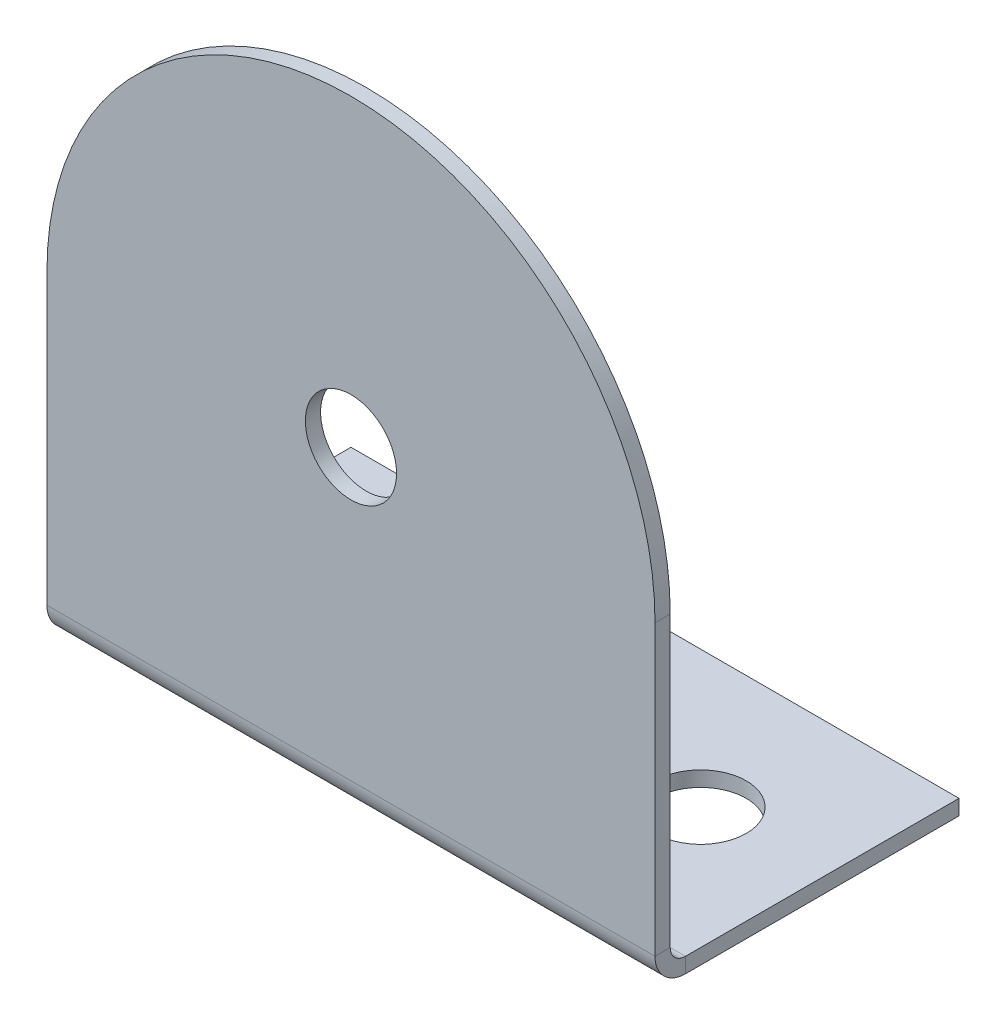
ISO-10303-21;
HEADER;
FILE_DESCRIPTION(('STEP AP214'),'2;1');
FILE_NAME('part.step','',(''),(''),'','','');
FILE_SCHEMA(('AUTOMOTIVE_DESIGN { 1 0 10303 214 1 1 1 1 }'));
ENDSEC;
DATA;
#1=APPLICATION_CONTEXT('core data for automotive mechanical design processes');
#2=APPLICATION_PROTOCOL_DEFINITION('international standard','automotive_design',2000,#1);
#3=PRODUCT_CONTEXT('',#1,'mechanical');
#4=PRODUCT('Part','Part','',(#3));
#5=PRODUCT_RELATED_PRODUCT_CATEGORY('part','',(#4));
#6=PRODUCT_DEFINITION_FORMATION('','',#4);
#7=PRODUCT_DEFINITION_CONTEXT('part definition',#1,'design');
#8=PRODUCT_DEFINITION('design','',#6,#7);
#9=PRODUCT_DEFINITION_SHAPE('','',#8);
#10=(LENGTH_UNIT() NAMED_UNIT(*) SI_UNIT(.MILLI.,.METRE.));
#11=(NAMED_UNIT(*) PLANE_ANGLE_UNIT() SI_UNIT($,.RADIAN.));
#12=(NAMED_UNIT(*) SI_UNIT($,.STERADIAN.) SOLID_ANGLE_UNIT());
#13=UNCERTAINTY_MEASURE_WITH_UNIT(LENGTH_MEASURE(1.E-05),#10,'distance_accuracy_value','');
#14=(GEOMETRIC_REPRESENTATION_CONTEXT(3) GLOBAL_UNCERTAINTY_ASSIGNED_CONTEXT((#13)) GLOBAL_UNIT_ASSIGNED_CONTEXT((#10,
#11,#12)) REPRESENTATION_CONTEXT('',''));
#15=CARTESIAN_POINT('',(0.,0.,0.));
#16=DIRECTION('',(0.,0.,1.));
#17=DIRECTION('',(1.,0.,0.));
#18=AXIS2_PLACEMENT_3D('',#15,#16,#17);
#19=CARTESIAN_POINT('',(20.,20.5,-0.500000000000001));
#20=DIRECTION('',(0.,0.,-1.));
#21=DIRECTION('',(0.,1.,0.));
#22=AXIS2_PLACEMENT_3D('',#19,#20,#21);
#23=PLANE('',#22);
#24=CARTESIAN_POINT('',(10.,10.5,-0.5));
#25=DIRECTION('',(0.,0.,-1.));
#26=DIRECTION('',(0.,1.,0.));
#27=AXIS2_PLACEMENT_3D('',#24,#25,#26);
#28=CIRCLE('',#27,1.5);
#29=CARTESIAN_POINT('',(10.,12.,-0.5));
#30=VERTEX_POINT('',#29);
#31=EDGE_CURVE('E235',#30,#30,#28,.T.);
#32=ORIENTED_EDGE('',*,*,#31,.F.);
#33=EDGE_LOOP('',(#32));
#34=FACE_BOUND('',#33,.T.);
#35=DIRECTION('',(0.,-1.,0.));
#36=VECTOR('',#35,1.);
#37=CARTESIAN_POINT('',(0.,20.5,-0.500000000000001));
#38=LINE('',#37,#36);
#39=CARTESIAN_POINT('',(0.,10.5,-0.5));
#40=VERTEX_POINT('',#39);
#41=CARTESIAN_POINT('',(0.,1.,-0.5));
#42=VERTEX_POINT('',#41);
#43=EDGE_CURVE('E188',#40,#42,#38,.T.);
#44=ORIENTED_EDGE('',*,*,#43,.F.);
#45=CARTESIAN_POINT('',(10.,10.5,-0.5));
#46=DIRECTION('',(0.,0.,-1.));
#47=DIRECTION('',(0.,1.,0.));
#48=AXIS2_PLACEMENT_3D('',#45,#46,#47);
#49=CIRCLE('',#48,10.);
#50=CARTESIAN_POINT('',(20.,10.5,-0.5));
#51=VERTEX_POINT('',#50);
#52=EDGE_CURVE('E146',#40,#51,#49,.T.);
#53=ORIENTED_EDGE('',*,*,#52,.T.);
#54=DIRECTION('',(0.,-1.,0.));
#55=VECTOR('',#54,1.);
#56=CARTESIAN_POINT('',(20.,20.5,-0.500000000000001));
#57=LINE('',#56,#55);
#58=CARTESIAN_POINT('',(20.,1.,-0.5));
#59=VERTEX_POINT('',#58);
#60=EDGE_CURVE('E140',#51,#59,#57,.T.);
#61=ORIENTED_EDGE('',*,*,#60,.T.);
#62=DIRECTION('',(-1.,0.,0.));
#63=VECTOR('',#62,1.);
#64=CARTESIAN_POINT('',(20.,1.,-0.5));
#65=LINE('',#64,#63);
#66=EDGE_CURVE('E143',#59,#42,#65,.T.);
#67=ORIENTED_EDGE('',*,*,#66,.T.);
#68=EDGE_LOOP('',(#44,#53,#61,#67));
#69=FACE_BOUND('',#68,.T.);
#70=ADVANCED_FACE('F72',(#34,#69),#23,.T.);
#71=CARTESIAN_POINT('',(20.,20.5,0.));
#72=DIRECTION('',(0.,0.,-1.));
#73=DIRECTION('',(0.,1.,0.));
#74=AXIS2_PLACEMENT_3D('',#71,#72,#73);
#75=PLANE('',#74);
#76=CARTESIAN_POINT('',(10.,10.5,0.));
#77=DIRECTION('',(0.,0.,-1.));
#78=DIRECTION('',(0.,1.,0.));
#79=AXIS2_PLACEMENT_3D('',#76,#77,#78);
#80=CIRCLE('',#79,1.5);
#81=CARTESIAN_POINT('',(10.,12.,0.));
#82=VERTEX_POINT('',#81);
#83=EDGE_CURVE('E233',#82,#82,#80,.T.);
#84=ORIENTED_EDGE('',*,*,#83,.T.);
#85=EDGE_LOOP('',(#84));
#86=FACE_BOUND('',#85,.T.);
#87=CARTESIAN_POINT('',(10.,10.5,0.));
#88=DIRECTION('',(0.,0.,-1.));
#89=DIRECTION('',(0.,1.,0.));
#90=AXIS2_PLACEMENT_3D('',#87,#88,#89);
#91=CIRCLE('',#90,10.);
#92=CARTESIAN_POINT('',(0.,10.5,0.));
#93=VERTEX_POINT('',#92);
#94=CARTESIAN_POINT('',(20.,10.5,0.));
#95=VERTEX_POINT('',#94);
#96=EDGE_CURVE('E223',#93,#95,#91,.T.);
#97=ORIENTED_EDGE('',*,*,#96,.F.);
#98=DIRECTION('',(0.,-1.,0.));
#99=VECTOR('',#98,1.);
#100=CARTESIAN_POINT('',(0.,20.5,0.));
#101=LINE('',#100,#99);
#102=CARTESIAN_POINT('',(0.,1.,0.));
#103=VERTEX_POINT('',#102);
#104=EDGE_CURVE('E113',#93,#103,#101,.T.);
#105=ORIENTED_EDGE('',*,*,#104,.T.);
#106=DIRECTION('',(-1.,0.,0.));
#107=VECTOR('',#106,1.);
#108=CARTESIAN_POINT('',(20.,1.,0.));
#109=LINE('',#108,#107);
#110=CARTESIAN_POINT('',(20.,1.,0.));
#111=VERTEX_POINT('',#110);
#112=EDGE_CURVE('E163',#111,#103,#109,.T.);
#113=ORIENTED_EDGE('',*,*,#112,.F.);
#114=DIRECTION('',(0.,-1.,0.));
#115=VECTOR('',#114,1.);
#116=CARTESIAN_POINT('',(20.,20.5,0.));
#117=LINE('',#116,#115);
#118=EDGE_CURVE('E149',#95,#111,#117,.T.);
#119=ORIENTED_EDGE('',*,*,#118,.F.);
#120=EDGE_LOOP('',(#97,#105,#113,#119));
#121=FACE_BOUND('',#120,.T.);
#122=ADVANCED_FACE('F221',(#86,#121),#75,.F.);
#123=CARTESIAN_POINT('',(20.,1.,0.));
#124=DIRECTION('',(1.,0.,0.));
#125=DIRECTION('',(0.,0.,-1.));
#126=AXIS2_PLACEMENT_3D('',#123,#124,#125);
#127=PLANE('',#126);
#128=DIRECTION('',(0.,0.,-1.));
#129=VECTOR('',#128,1.);
#130=CARTESIAN_POINT('',(20.,1.,0.));
#131=LINE('',#130,#129);
#132=EDGE_CURVE('E14',#111,#59,#131,.T.);
#133=ORIENTED_EDGE('',*,*,#132,.F.);
#134=CARTESIAN_POINT('',(20.,1.,-1.));
#135=DIRECTION('',(-1.,0.,0.));
#136=DIRECTION('',(0.,0.,1.));
#137=AXIS2_PLACEMENT_3D('',#134,#135,#136);
#138=CIRCLE('',#137,1.);
#139=CARTESIAN_POINT('',(20.,0.,-1.));
#140=VERTEX_POINT('',#139);
#141=EDGE_CURVE('E174',#111,#140,#138,.F.);
#142=ORIENTED_EDGE('',*,*,#141,.T.);
#143=DIRECTION('',(0.,-1.,0.));
#144=VECTOR('',#143,1.);
#145=CARTESIAN_POINT('',(20.,0.5,-1.));
#146=LINE('',#145,#144);
#147=CARTESIAN_POINT('',(20.,0.5,-1.));
#148=VERTEX_POINT('',#147);
#149=EDGE_CURVE('E81',#148,#140,#146,.T.);
#150=ORIENTED_EDGE('',*,*,#149,.F.);
#151=CARTESIAN_POINT('',(20.,1.,-1.));
#152=DIRECTION('',(1.,0.,0.));
#153=DIRECTION('',(0.,0.,-1.));
#154=AXIS2_PLACEMENT_3D('',#151,#152,#153);
#155=CIRCLE('',#154,0.5);
#156=EDGE_CURVE('E150',#59,#148,#155,.T.);
#157=ORIENTED_EDGE('',*,*,#156,.F.);
#158=EDGE_LOOP('',(#133,#142,#150,#157));
#159=FACE_BOUND('',#158,.T.);
#160=ADVANCED_FACE('F74',(#159),#127,.T.);
#161=CARTESIAN_POINT('',(20.,0.5,-1.));
#162=DIRECTION('',(1.,0.,0.));
#163=DIRECTION('',(0.,0.,-1.));
#164=AXIS2_PLACEMENT_3D('',#161,#162,#163);
#165=PLANE('',#164);
#166=DIRECTION('',(0.,0.,-1.));
#167=VECTOR('',#166,1.);
#168=CARTESIAN_POINT('',(20.,10.5,-0.5));
#169=LINE('',#168,#167);
#170=EDGE_CURVE('E232',#51,#95,#169,.F.);
#171=ORIENTED_EDGE('',*,*,#170,.T.);
#172=ORIENTED_EDGE('',*,*,#118,.T.);
#173=ORIENTED_EDGE('',*,*,#132,.T.);
#174=ORIENTED_EDGE('',*,*,#60,.F.);
#175=EDGE_LOOP('',(#171,#172,#173,#174));
#176=FACE_BOUND('',#175,.T.);
#177=ADVANCED_FACE('F153',(#176),#165,.T.);
#178=CARTESIAN_POINT('',(0.,0.,-1.));
#179=DIRECTION('',(-1.,0.,0.));
#180=DIRECTION('',(0.,0.,1.));
#181=AXIS2_PLACEMENT_3D('',#178,#179,#180);
#182=PLANE('',#181);
#183=DIRECTION('',(0.,1.,0.));
#184=VECTOR('',#183,1.);
#185=CARTESIAN_POINT('',(0.,0.,-1.));
#186=LINE('',#185,#184);
#187=CARTESIAN_POINT('',(0.,0.,-1.));
#188=VERTEX_POINT('',#187);
#189=CARTESIAN_POINT('',(0.,0.5,-1.));
#190=VERTEX_POINT('',#189);
#191=EDGE_CURVE('E120',#188,#190,#186,.T.);
#192=ORIENTED_EDGE('',*,*,#191,.F.);
#193=CARTESIAN_POINT('',(0.,1.,-1.));
#194=DIRECTION('',(-1.,0.,0.));
#195=DIRECTION('',(0.,0.,1.));
#196=AXIS2_PLACEMENT_3D('',#193,#194,#195);
#197=CIRCLE('',#196,1.);
#198=EDGE_CURVE('E191',#103,#188,#197,.F.);
#199=ORIENTED_EDGE('',*,*,#198,.F.);
#200=DIRECTION('',(0.,0.,1.));
#201=VECTOR('',#200,1.);
#202=CARTESIAN_POINT('',(0.,1.,-0.5));
#203=LINE('',#202,#201);
#204=EDGE_CURVE('E202',#42,#103,#203,.T.);
#205=ORIENTED_EDGE('',*,*,#204,.F.);
#206=CARTESIAN_POINT('',(0.,1.,-1.));
#207=DIRECTION('',(1.,0.,0.));
#208=DIRECTION('',(0.,0.,-1.));
#209=AXIS2_PLACEMENT_3D('',#206,#207,#208);
#210=CIRCLE('',#209,0.5);
#211=EDGE_CURVE('E161',#42,#190,#210,.T.);
#212=ORIENTED_EDGE('',*,*,#211,.T.);
#213=EDGE_LOOP('',(#192,#199,#205,#212));
#214=FACE_BOUND('',#213,.T.);
#215=ADVANCED_FACE('F212',(#214),#182,.T.);
#216=CARTESIAN_POINT('',(0.,1.,-0.5));
#217=DIRECTION('',(-1.,0.,0.));
#218=DIRECTION('',(0.,0.,1.));
#219=AXIS2_PLACEMENT_3D('',#216,#217,#218);
#220=PLANE('',#219);
#221=DIRECTION('',(0.,0.,-1.));
#222=VECTOR('',#221,1.);
#223=CARTESIAN_POINT('',(0.,0.,0.));
#224=LINE('',#223,#222);
#225=CARTESIAN_POINT('',(0.,0.,-10.));
#226=VERTEX_POINT('',#225);
#227=EDGE_CURVE('E177',#188,#226,#224,.T.);
#228=ORIENTED_EDGE('',*,*,#227,.F.);
#229=ORIENTED_EDGE('',*,*,#191,.T.);
#230=DIRECTION('',(0.,0.,-1.));
#231=VECTOR('',#230,1.);
#232=CARTESIAN_POINT('',(0.,0.5,0.));
#233=LINE('',#232,#231);
#234=CARTESIAN_POINT('',(0.,0.500000000000003,-10.));
#235=VERTEX_POINT('',#234);
#236=EDGE_CURVE('E184',#190,#235,#233,.T.);
#237=ORIENTED_EDGE('',*,*,#236,.T.);
#238=DIRECTION('',(0.,-1.,0.));
#239=VECTOR('',#238,1.);
#240=CARTESIAN_POINT('',(0.,0.500000000000003,-10.));
#241=LINE('',#240,#239);
#242=EDGE_CURVE('E180',#235,#226,#241,.T.);
#243=ORIENTED_EDGE('',*,*,#242,.T.);
#244=EDGE_LOOP('',(#228,#229,#237,#243));
#245=FACE_BOUND('',#244,.T.);
#246=ADVANCED_FACE('F206',(#245),#220,.T.);
#247=CARTESIAN_POINT('',(20.,0.,0.));
#248=DIRECTION('',(0.,1.,0.));
#249=DIRECTION('',(0.,0.,1.));
#250=AXIS2_PLACEMENT_3D('',#247,#248,#249);
#251=PLANE('',#250);
#252=CARTESIAN_POINT('',(16.,0.,-5.5));
#253=DIRECTION('',(0.,1.,0.));
#254=DIRECTION('',(0.,0.,1.));
#255=AXIS2_PLACEMENT_3D('',#252,#253,#254);
#256=CIRCLE('',#255,1.5);
#257=CARTESIAN_POINT('',(16.,0.,-4.));
#258=VERTEX_POINT('',#257);
#259=EDGE_CURVE('E247',#258,#258,#256,.T.);
#260=ORIENTED_EDGE('',*,*,#259,.T.);
#261=EDGE_LOOP('',(#260));
#262=FACE_BOUND('',#261,.T.);
#263=CARTESIAN_POINT('',(4.,0.,-5.5));
#264=DIRECTION('',(0.,1.,0.));
#265=DIRECTION('',(0.,0.,1.));
#266=AXIS2_PLACEMENT_3D('',#263,#264,#265);
#267=CIRCLE('',#266,1.5);
#268=CARTESIAN_POINT('',(4.,0.,-4.));
#269=VERTEX_POINT('',#268);
#270=EDGE_CURVE('E181',#269,#269,#267,.T.);
#271=ORIENTED_EDGE('',*,*,#270,.T.);
#272=EDGE_LOOP('',(#271));
#273=FACE_BOUND('',#272,.T.);
#274=ORIENTED_EDGE('',*,*,#227,.T.);
#275=DIRECTION('',(-1.,0.,0.));
#276=VECTOR('',#275,1.);
#277=CARTESIAN_POINT('',(20.,0.,-10.));
#278=LINE('',#277,#276);
#279=CARTESIAN_POINT('',(20.,0.,-10.));
#280=VERTEX_POINT('',#279);
#281=EDGE_CURVE('E200',#280,#226,#278,.T.);
#282=ORIENTED_EDGE('',*,*,#281,.F.);
#283=DIRECTION('',(0.,0.,-1.));
#284=VECTOR('',#283,1.);
#285=CARTESIAN_POINT('',(20.,0.,0.));
#286=LINE('',#285,#284);
#287=EDGE_CURVE('E126',#140,#280,#286,.T.);
#288=ORIENTED_EDGE('',*,*,#287,.F.);
#289=DIRECTION('',(-1.,0.,0.));
#290=VECTOR('',#289,1.);
#291=CARTESIAN_POINT('',(20.,0.,-1.));
#292=LINE('',#291,#290);
#293=EDGE_CURVE('E176',#140,#188,#292,.T.);
#294=ORIENTED_EDGE('',*,*,#293,.T.);
#295=EDGE_LOOP('',(#274,#282,#288,#294));
#296=FACE_BOUND('',#295,.T.);
#297=ADVANCED_FACE('F286',(#262,#273,#296),#251,.F.);
#298=CARTESIAN_POINT('',(20.,0.500000000000003,-10.));
#299=DIRECTION('',(0.,0.,-1.));
#300=DIRECTION('',(-1.,0.,0.));
#301=AXIS2_PLACEMENT_3D('',#298,#299,#300);
#302=PLANE('',#301);
#303=ORIENTED_EDGE('',*,*,#242,.F.);
#304=DIRECTION('',(-1.,0.,0.));
#305=VECTOR('',#304,1.);
#306=CARTESIAN_POINT('',(20.,0.500000000000003,-10.));
#307=LINE('',#306,#305);
#308=CARTESIAN_POINT('',(20.,0.500000000000003,-10.));
#309=VERTEX_POINT('',#308);
#310=EDGE_CURVE('E198',#309,#235,#307,.T.);
#311=ORIENTED_EDGE('',*,*,#310,.F.);
#312=DIRECTION('',(0.,-1.,0.));
#313=VECTOR('',#312,1.);
#314=CARTESIAN_POINT('',(20.,0.500000000000003,-10.));
#315=LINE('',#314,#313);
#316=EDGE_CURVE('E169',#309,#280,#315,.T.);
#317=ORIENTED_EDGE('',*,*,#316,.T.);
#318=ORIENTED_EDGE('',*,*,#281,.T.);
#319=EDGE_LOOP('',(#303,#311,#317,#318));
#320=FACE_BOUND('',#319,.T.);
#321=ADVANCED_FACE('F257',(#320),#302,.T.);
#322=CARTESIAN_POINT('',(20.,0.5,0.));
#323=DIRECTION('',(0.,1.,0.));
#324=DIRECTION('',(0.,0.,1.));
#325=AXIS2_PLACEMENT_3D('',#322,#323,#324);
#326=PLANE('',#325);
#327=CARTESIAN_POINT('',(16.,0.500000000000002,-5.5));
#328=DIRECTION('',(0.,1.,0.));
#329=DIRECTION('',(0.,0.,-1.));
#330=AXIS2_PLACEMENT_3D('',#327,#328,#329);
#331=CIRCLE('',#330,1.5);
#332=CARTESIAN_POINT('',(16.,0.500000000000002,-7.));
#333=VERTEX_POINT('',#332);
#334=EDGE_CURVE('E244',#333,#333,#331,.T.);
#335=ORIENTED_EDGE('',*,*,#334,.F.);
#336=EDGE_LOOP('',(#335));
#337=FACE_BOUND('',#336,.T.);
#338=CARTESIAN_POINT('',(4.,0.500000000000002,-5.5));
#339=DIRECTION('',(0.,1.,0.));
#340=DIRECTION('',(0.,0.,1.));
#341=AXIS2_PLACEMENT_3D('',#338,#339,#340);
#342=CIRCLE('',#341,1.5);
#343=CARTESIAN_POINT('',(4.,0.500000000000001,-4.));
#344=VERTEX_POINT('',#343);
#345=EDGE_CURVE('E250',#344,#344,#342,.T.);
#346=ORIENTED_EDGE('',*,*,#345,.F.);
#347=EDGE_LOOP('',(#346));
#348=FACE_BOUND('',#347,.T.);
#349=ORIENTED_EDGE('',*,*,#236,.F.);
#350=DIRECTION('',(-1.,0.,0.));
#351=VECTOR('',#350,1.);
#352=CARTESIAN_POINT('',(20.,0.5,-1.));
#353=LINE('',#352,#351);
#354=EDGE_CURVE('E162',#148,#190,#353,.T.);
#355=ORIENTED_EDGE('',*,*,#354,.F.);
#356=DIRECTION('',(0.,0.,-1.));
#357=VECTOR('',#356,1.);
#358=CARTESIAN_POINT('',(20.,0.5,0.));
#359=LINE('',#358,#357);
#360=EDGE_CURVE('E166',#148,#309,#359,.T.);
#361=ORIENTED_EDGE('',*,*,#360,.T.);
#362=ORIENTED_EDGE('',*,*,#310,.T.);
#363=EDGE_LOOP('',(#349,#355,#361,#362));
#364=FACE_BOUND('',#363,.T.);
#365=ADVANCED_FACE('F209',(#337,#348,#364),#326,.T.);
#366=CARTESIAN_POINT('',(20.,1.,-1.));
#367=DIRECTION('',(-1.,0.,0.));
#368=DIRECTION('',(0.,0.,1.));
#369=AXIS2_PLACEMENT_3D('',#366,#367,#368);
#370=CYLINDRICAL_SURFACE('',#369,0.5);
#371=ORIENTED_EDGE('',*,*,#211,.F.);
#372=ORIENTED_EDGE('',*,*,#66,.F.);
#373=ORIENTED_EDGE('',*,*,#156,.T.);
#374=ORIENTED_EDGE('',*,*,#354,.T.);
#375=EDGE_LOOP('',(#371,#372,#373,#374));
#376=FACE_BOUND('',#375,.T.);
#377=ADVANCED_FACE('F159',(#376),#370,.F.);
#378=CARTESIAN_POINT('',(20.,1.,-1.));
#379=DIRECTION('',(-1.,0.,0.));
#380=DIRECTION('',(0.,0.,1.));
#381=AXIS2_PLACEMENT_3D('',#378,#379,#380);
#382=CYLINDRICAL_SURFACE('',#381,1.);
#383=ORIENTED_EDGE('',*,*,#198,.T.);
#384=ORIENTED_EDGE('',*,*,#293,.F.);
#385=ORIENTED_EDGE('',*,*,#141,.F.);
#386=ORIENTED_EDGE('',*,*,#112,.T.);
#387=EDGE_LOOP('',(#383,#384,#385,#386));
#388=FACE_BOUND('',#387,.T.);
#389=ADVANCED_FACE('F219',(#388),#382,.T.);
#390=CARTESIAN_POINT('',(20.,1.,-1.));
#391=DIRECTION('',(1.,0.,0.));
#392=DIRECTION('',(0.,0.,-1.));
#393=AXIS2_PLACEMENT_3D('',#390,#391,#392);
#394=PLANE('',#393);
#395=ORIENTED_EDGE('',*,*,#287,.T.);
#396=ORIENTED_EDGE('',*,*,#316,.F.);
#397=ORIENTED_EDGE('',*,*,#360,.F.);
#398=ORIENTED_EDGE('',*,*,#149,.T.);
#399=EDGE_LOOP('',(#395,#396,#397,#398));
#400=FACE_BOUND('',#399,.T.);
#401=ADVANCED_FACE('F258',(#400),#394,.T.);
#402=CARTESIAN_POINT('',(0.,1.,-1.));
#403=DIRECTION('',(1.,0.,0.));
#404=DIRECTION('',(0.,0.,-1.));
#405=AXIS2_PLACEMENT_3D('',#402,#403,#404);
#406=PLANE('',#405);
#407=ORIENTED_EDGE('',*,*,#104,.F.);
#408=DIRECTION('',(0.,0.,-1.));
#409=VECTOR('',#408,1.);
#410=CARTESIAN_POINT('',(0.,10.5,-0.5));
#411=LINE('',#410,#409);
#412=EDGE_CURVE('E231',#40,#93,#411,.F.);
#413=ORIENTED_EDGE('',*,*,#412,.F.);
#414=ORIENTED_EDGE('',*,*,#43,.T.);
#415=ORIENTED_EDGE('',*,*,#204,.T.);
#416=EDGE_LOOP('',(#407,#413,#414,#415));
#417=FACE_BOUND('',#416,.T.);
#418=ADVANCED_FACE('F214',(#417),#406,.F.);
#419=CARTESIAN_POINT('',(4.,-9.5,-5.5));
#420=DIRECTION('',(0.,1.,0.));
#421=DIRECTION('',(0.,0.,1.));
#422=AXIS2_PLACEMENT_3D('',#419,#420,#421);
#423=CYLINDRICAL_SURFACE('',#422,1.5);
#424=ORIENTED_EDGE('',*,*,#345,.T.);
#425=EDGE_LOOP('',(#424));
#426=FACE_BOUND('',#425,.T.);
#427=ORIENTED_EDGE('',*,*,#270,.F.);
#428=EDGE_LOOP('',(#427));
#429=FACE_BOUND('',#428,.T.);
#430=ADVANCED_FACE('F265',(#426,#429),#423,.F.);
#431=CARTESIAN_POINT('',(16.,-9.5,-5.50000000000001));
#432=DIRECTION('',(0.,1.,0.));
#433=DIRECTION('',(0.,0.,1.));
#434=AXIS2_PLACEMENT_3D('',#431,#432,#433);
#435=CYLINDRICAL_SURFACE('',#434,1.5);
#436=ORIENTED_EDGE('',*,*,#334,.T.);
#437=EDGE_LOOP('',(#436));
#438=FACE_BOUND('',#437,.T.);
#439=ORIENTED_EDGE('',*,*,#259,.F.);
#440=EDGE_LOOP('',(#439));
#441=FACE_BOUND('',#440,.T.);
#442=ADVANCED_FACE('F334',(#438,#441),#435,.F.);
#443=CARTESIAN_POINT('',(10.,10.5,-0.5));
#444=DIRECTION('',(0.,0.,-1.));
#445=DIRECTION('',(0.,1.,0.));
#446=AXIS2_PLACEMENT_3D('',#443,#444,#445);
#447=CYLINDRICAL_SURFACE('',#446,10.);
#448=ORIENTED_EDGE('',*,*,#170,.F.);
#449=ORIENTED_EDGE('',*,*,#52,.F.);
#450=ORIENTED_EDGE('',*,*,#412,.T.);
#451=ORIENTED_EDGE('',*,*,#96,.T.);
#452=EDGE_LOOP('',(#448,#449,#450,#451));
#453=FACE_BOUND('',#452,.T.);
#454=ADVANCED_FACE('F230',(#453),#447,.T.);
#455=CARTESIAN_POINT('',(10.,10.5,-0.5));
#456=DIRECTION('',(0.,0.,-1.));
#457=DIRECTION('',(0.,1.,0.));
#458=AXIS2_PLACEMENT_3D('',#455,#456,#457);
#459=CYLINDRICAL_SURFACE('',#458,1.5);
#460=ORIENTED_EDGE('',*,*,#83,.F.);
#461=EDGE_LOOP('',(#460));
#462=FACE_BOUND('',#461,.T.);
#463=ORIENTED_EDGE('',*,*,#31,.T.);
#464=EDGE_LOOP('',(#463));
#465=FACE_BOUND('',#464,.T.);
#466=ADVANCED_FACE('F333',(#462,#465),#459,.F.);
#467=CLOSED_SHELL('',(#70,#122,#160,#177,#215,#246,#297,#321,#365,#377,#389,#401,#418,#430,#442,
#454,#466));
#468=MANIFOLD_SOLID_BREP('B2',#467);
#469=ADVANCED_BREP_SHAPE_REPRESENTATION('',(#18,#468),#14);
#470=SHAPE_DEFINITION_REPRESENTATION(#9,#469);
ENDSEC;
END-ISO-10303-21;
